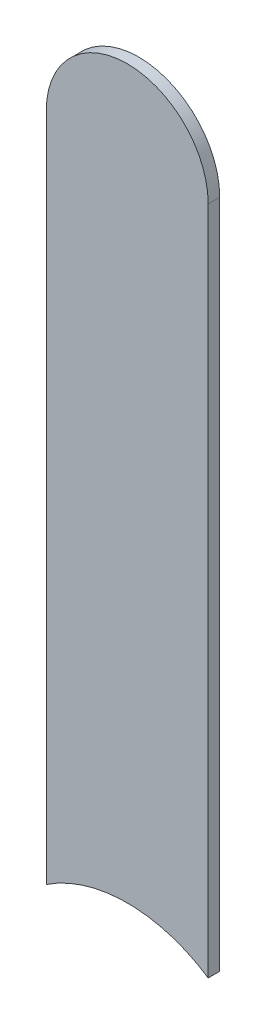
ISO-10303-21;
HEADER;
FILE_DESCRIPTION(('STEP AP214'),'2;1');
FILE_NAME('part.step','',(''),(''),'','','');
FILE_SCHEMA(('AUTOMOTIVE_DESIGN { 1 0 10303 214 1 1 1 1 }'));
ENDSEC;
DATA;
#1=APPLICATION_CONTEXT('core data for automotive mechanical design processes');
#2=APPLICATION_PROTOCOL_DEFINITION('international standard','automotive_design',2000,#1);
#3=PRODUCT_CONTEXT('',#1,'mechanical');
#4=PRODUCT('Part','Part','',(#3));
#5=PRODUCT_RELATED_PRODUCT_CATEGORY('part','',(#4));
#6=PRODUCT_DEFINITION_FORMATION('','',#4);
#7=PRODUCT_DEFINITION_CONTEXT('part definition',#1,'design');
#8=PRODUCT_DEFINITION('design','',#6,#7);
#9=PRODUCT_DEFINITION_SHAPE('','',#8);
#10=(LENGTH_UNIT() NAMED_UNIT(*) SI_UNIT(.MILLI.,.METRE.));
#11=(NAMED_UNIT(*) PLANE_ANGLE_UNIT() SI_UNIT($,.RADIAN.));
#12=(NAMED_UNIT(*) SI_UNIT($,.STERADIAN.) SOLID_ANGLE_UNIT());
#13=UNCERTAINTY_MEASURE_WITH_UNIT(LENGTH_MEASURE(1.E-05),#10,'distance_accuracy_value','');
#14=(GEOMETRIC_REPRESENTATION_CONTEXT(3) GLOBAL_UNCERTAINTY_ASSIGNED_CONTEXT((#13)) GLOBAL_UNIT_ASSIGNED_CONTEXT((#10,
#11,#12)) REPRESENTATION_CONTEXT('',''));
#15=CARTESIAN_POINT('',(0.,0.,0.));
#16=DIRECTION('',(0.,0.,1.));
#17=DIRECTION('',(1.,0.,0.));
#18=AXIS2_PLACEMENT_3D('',#15,#16,#17);
#19=CARTESIAN_POINT('',(62.5700171,57.8741769903459,0.));
#20=DIRECTION('',(-1.,0.,0.));
#21=DIRECTION('',(0.,1.,0.));
#22=AXIS2_PLACEMENT_3D('',#19,#20,#21);
#23=PLANE('',#22);
#24=DIRECTION('',(0.,1.,0.));
#25=VECTOR('',#24,1.);
#26=CARTESIAN_POINT('',(62.5700171,57.500012,0.03556));
#27=LINE('',#26,#25);
#28=CARTESIAN_POINT('',(62.5700171,57.8741769903459,0.03556));
#29=VERTEX_POINT('',#28);
#30=CARTESIAN_POINT('',(62.5700171,59.944,0.03556));
#31=VERTEX_POINT('',#30);
#32=EDGE_CURVE('E11',#29,#31,#27,.T.);
#33=ORIENTED_EDGE('',*,*,#32,.F.);
#34=DIRECTION('',(0.,0.,1.));
#35=VECTOR('',#34,1.);
#36=CARTESIAN_POINT('',(62.5700171,57.8741769903459,0.));
#37=LINE('',#36,#35);
#38=CARTESIAN_POINT('',(62.5700171,57.8741769903459,0.));
#39=VERTEX_POINT('',#38);
#40=EDGE_CURVE('E24',#39,#29,#37,.T.);
#41=ORIENTED_EDGE('',*,*,#40,.F.);
#42=DIRECTION('',(0.,1.,0.));
#43=VECTOR('',#42,1.);
#44=CARTESIAN_POINT('',(62.5700171,57.500012,0.));
#45=LINE('',#44,#43);
#46=CARTESIAN_POINT('',(62.5700171,59.944,0.));
#47=VERTEX_POINT('',#46);
#48=EDGE_CURVE('E75',#39,#47,#45,.T.);
#49=ORIENTED_EDGE('',*,*,#48,.T.);
#50=DIRECTION('',(0.,0.,1.));
#51=VECTOR('',#50,1.);
#52=CARTESIAN_POINT('',(62.5700171,59.944,0.));
#53=LINE('',#52,#51);
#54=EDGE_CURVE('E37',#47,#31,#53,.T.);
#55=ORIENTED_EDGE('',*,*,#54,.T.);
#56=EDGE_LOOP('',(#33,#41,#49,#55));
#57=FACE_BOUND('',#56,.T.);
#58=ADVANCED_FACE('F17',(#57),#23,.F.);
#59=CARTESIAN_POINT('',(62.3200176,59.944,0.));
#60=DIRECTION('',(0.,0.,-1.));
#61=DIRECTION('',(1.,0.,0.));
#62=AXIS2_PLACEMENT_3D('',#59,#60,#61);
#63=CYLINDRICAL_SURFACE('',#62,0.249999499999997);
#64=CARTESIAN_POINT('',(62.3200176,59.944,0.03556));
#65=DIRECTION('',(0.,0.,1.));
#66=DIRECTION('',(1.,0.,0.));
#67=AXIS2_PLACEMENT_3D('',#64,#65,#66);
#68=CIRCLE('',#67,0.249999499999997);
#69=CARTESIAN_POINT('',(62.0700181,59.944,0.03556));
#70=VERTEX_POINT('',#69);
#71=EDGE_CURVE('E83',#31,#70,#68,.T.);
#72=ORIENTED_EDGE('',*,*,#71,.F.);
#73=ORIENTED_EDGE('',*,*,#54,.F.);
#74=CARTESIAN_POINT('',(62.3200176,59.944,0.));
#75=DIRECTION('',(0.,0.,1.));
#76=DIRECTION('',(1.,0.,0.));
#77=AXIS2_PLACEMENT_3D('',#74,#75,#76);
#78=CIRCLE('',#77,0.249999499999997);
#79=CARTESIAN_POINT('',(62.0700181,59.944,0.));
#80=VERTEX_POINT('',#79);
#81=EDGE_CURVE('E81',#47,#80,#78,.T.);
#82=ORIENTED_EDGE('',*,*,#81,.T.);
#83=DIRECTION('',(0.,0.,1.));
#84=VECTOR('',#83,1.);
#85=CARTESIAN_POINT('',(62.0700181,59.944,0.));
#86=LINE('',#85,#84);
#87=EDGE_CURVE('E67',#80,#70,#86,.T.);
#88=ORIENTED_EDGE('',*,*,#87,.T.);
#89=EDGE_LOOP('',(#72,#73,#82,#88));
#90=FACE_BOUND('',#89,.T.);
#91=ADVANCED_FACE('F89',(#90),#63,.T.);
#92=CARTESIAN_POINT('',(62.0700181,59.944,0.));
#93=DIRECTION('',(1.,0.,0.));
#94=DIRECTION('',(0.,-1.,0.));
#95=AXIS2_PLACEMENT_3D('',#92,#93,#94);
#96=PLANE('',#95);
#97=DIRECTION('',(0.,-1.,0.));
#98=VECTOR('',#97,1.);
#99=CARTESIAN_POINT('',(62.0700181,59.944,0.03556));
#100=LINE('',#99,#98);
#101=CARTESIAN_POINT('',(62.0700181,57.8741769903459,0.03556));
#102=VERTEX_POINT('',#101);
#103=EDGE_CURVE('E71',#70,#102,#100,.T.);
#104=ORIENTED_EDGE('',*,*,#103,.F.);
#105=ORIENTED_EDGE('',*,*,#87,.F.);
#106=DIRECTION('',(0.,-1.,0.));
#107=VECTOR('',#106,1.);
#108=CARTESIAN_POINT('',(62.0700181,59.944,0.));
#109=LINE('',#108,#107);
#110=CARTESIAN_POINT('',(62.0700181,57.8741769903459,0.));
#111=VERTEX_POINT('',#110);
#112=EDGE_CURVE('E63',#80,#111,#109,.T.);
#113=ORIENTED_EDGE('',*,*,#112,.T.);
#114=DIRECTION('',(0.,0.,1.));
#115=VECTOR('',#114,1.);
#116=CARTESIAN_POINT('',(62.0700181,57.8741769903459,0.));
#117=LINE('',#116,#115);
#118=EDGE_CURVE('E53',#111,#102,#117,.T.);
#119=ORIENTED_EDGE('',*,*,#118,.T.);
#120=EDGE_LOOP('',(#104,#105,#113,#119));
#121=FACE_BOUND('',#120,.T.);
#122=ADVANCED_FACE('F66',(#121),#96,.F.);
#123=CARTESIAN_POINT('',(62.3200176,57.500012,0.));
#124=DIRECTION('',(0.,0.,-1.));
#125=DIRECTION('',(1.,0.,0.));
#126=AXIS2_PLACEMENT_3D('',#123,#124,#125);
#127=CYLINDRICAL_SURFACE('',#126,0.4499991);
#128=ORIENTED_EDGE('',*,*,#40,.T.);
#129=CARTESIAN_POINT('',(62.3200176,57.500012,0.03556));
#130=DIRECTION('',(0.,0.,1.));
#131=DIRECTION('',(1.,0.,0.));
#132=AXIS2_PLACEMENT_3D('',#129,#130,#131);
#133=CIRCLE('',#132,0.4499991);
#134=EDGE_CURVE('E59',#29,#102,#133,.T.);
#135=ORIENTED_EDGE('',*,*,#134,.T.);
#136=ORIENTED_EDGE('',*,*,#118,.F.);
#137=CARTESIAN_POINT('',(62.3200176,57.500012,0.));
#138=DIRECTION('',(0.,0.,1.));
#139=DIRECTION('',(1.,0.,0.));
#140=AXIS2_PLACEMENT_3D('',#137,#138,#139);
#141=CIRCLE('',#140,0.4499991);
#142=EDGE_CURVE('E57',#39,#111,#141,.T.);
#143=ORIENTED_EDGE('',*,*,#142,.F.);
#144=EDGE_LOOP('',(#128,#135,#136,#143));
#145=FACE_BOUND('',#144,.T.);
#146=ADVANCED_FACE('F55',(#145),#127,.F.);
#147=CARTESIAN_POINT('',(62.5700171,57.500012,0.));
#148=DIRECTION('',(0.,0.,-1.));
#149=DIRECTION('',(-1.,0.,0.));
#150=AXIS2_PLACEMENT_3D('',#147,#148,#149);
#151=PLANE('',#150);
#152=ORIENTED_EDGE('',*,*,#48,.F.);
#153=ORIENTED_EDGE('',*,*,#142,.T.);
#154=ORIENTED_EDGE('',*,*,#112,.F.);
#155=ORIENTED_EDGE('',*,*,#81,.F.);
#156=EDGE_LOOP('',(#152,#153,#154,#155));
#157=FACE_BOUND('',#156,.T.);
#158=ADVANCED_FACE('F74',(#157),#151,.T.);
#159=CARTESIAN_POINT('',(62.5700171,57.500012,0.03556));
#160=DIRECTION('',(0.,0.,-1.));
#161=DIRECTION('',(-1.,0.,0.));
#162=AXIS2_PLACEMENT_3D('',#159,#160,#161);
#163=PLANE('',#162);
#164=ORIENTED_EDGE('',*,*,#134,.F.);
#165=ORIENTED_EDGE('',*,*,#32,.T.);
#166=ORIENTED_EDGE('',*,*,#71,.T.);
#167=ORIENTED_EDGE('',*,*,#103,.T.);
#168=EDGE_LOOP('',(#164,#165,#166,#167));
#169=FACE_BOUND('',#168,.T.);
#170=ADVANCED_FACE('F91',(#169),#163,.F.);
#171=CLOSED_SHELL('',(#58,#91,#122,#146,#158,#170));
#172=MANIFOLD_SOLID_BREP('B1',#171);
#173=ADVANCED_BREP_SHAPE_REPRESENTATION('',(#18,#172),#14);
#174=SHAPE_DEFINITION_REPRESENTATION(#9,#173);
ENDSEC;
END-ISO-10303-21;
